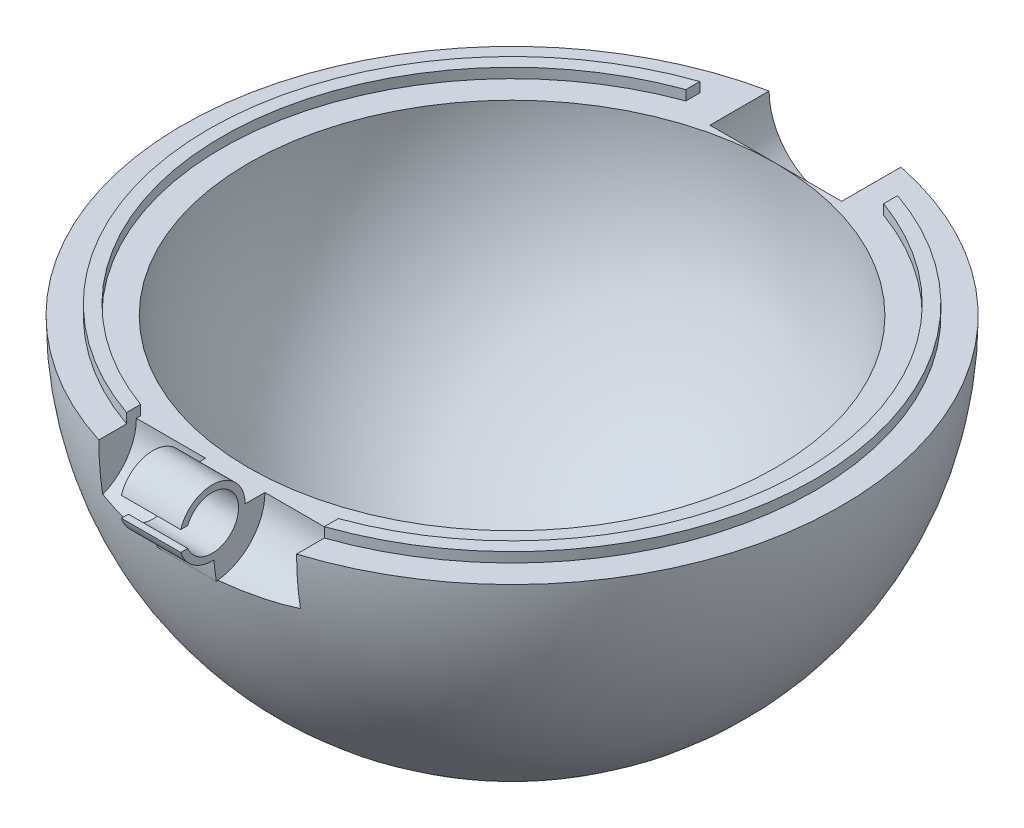
ISO-10303-21;
HEADER;
FILE_DESCRIPTION(('STEP AP214'),'2;1');
FILE_NAME('part.step','',(''),(''),'','','');
FILE_SCHEMA(('AUTOMOTIVE_DESIGN { 1 0 10303 214 1 1 1 1 }'));
ENDSEC;
DATA;
#1=APPLICATION_CONTEXT('core data for automotive mechanical design processes');
#2=APPLICATION_PROTOCOL_DEFINITION('international standard','automotive_design',2000,#1);
#3=PRODUCT_CONTEXT('',#1,'mechanical');
#4=PRODUCT('Part','Part','',(#3));
#5=PRODUCT_RELATED_PRODUCT_CATEGORY('part','',(#4));
#6=PRODUCT_DEFINITION_FORMATION('','',#4);
#7=PRODUCT_DEFINITION_CONTEXT('part definition',#1,'design');
#8=PRODUCT_DEFINITION('design','',#6,#7);
#9=PRODUCT_DEFINITION_SHAPE('','',#8);
#10=(LENGTH_UNIT() NAMED_UNIT(*) SI_UNIT(.MILLI.,.METRE.));
#11=(NAMED_UNIT(*) PLANE_ANGLE_UNIT() SI_UNIT($,.RADIAN.));
#12=(NAMED_UNIT(*) SI_UNIT($,.STERADIAN.) SOLID_ANGLE_UNIT());
#13=UNCERTAINTY_MEASURE_WITH_UNIT(LENGTH_MEASURE(1.E-05),#10,'distance_accuracy_value','');
#14=(GEOMETRIC_REPRESENTATION_CONTEXT(3) GLOBAL_UNCERTAINTY_ASSIGNED_CONTEXT((#13)) GLOBAL_UNIT_ASSIGNED_CONTEXT((#10,
#11,#12)) REPRESENTATION_CONTEXT('',''));
#15=CARTESIAN_POINT('',(0.,0.,0.));
#16=DIRECTION('',(0.,0.,1.));
#17=DIRECTION('',(1.,0.,0.));
#18=AXIS2_PLACEMENT_3D('',#15,#16,#17);
#19=CARTESIAN_POINT('',(-4.5,0.,50.));
#20=DIRECTION('',(1.,0.,0.));
#21=DIRECTION('',(0.,0.,-1.));
#22=AXIS2_PLACEMENT_3D('',#19,#20,#21);
#23=PLANE('',#22);
#24=DIRECTION('',(0.,0.,-1.));
#25=VECTOR('',#24,1.);
#26=CARTESIAN_POINT('',(-4.5,-1.5,60.));
#27=LINE('',#26,#25);
#28=CARTESIAN_POINT('',(-4.5,-1.5,54.7696960070847));
#29=VERTEX_POINT('',#28);
#30=CARTESIAN_POINT('',(-4.5,-1.5,53.7080992435478));
#31=VERTEX_POINT('',#30);
#32=EDGE_CURVE('E61',#29,#31,#27,.T.);
#33=ORIENTED_EDGE('',*,*,#32,.T.);
#34=CARTESIAN_POINT('',(-4.5,0.,50.));
#35=DIRECTION('',(-1.,0.,0.));
#36=DIRECTION('',(0.,0.,-1.));
#37=AXIS2_PLACEMENT_3D('',#34,#35,#36);
#38=CIRCLE('',#37,4.00000000000001);
#39=CARTESIAN_POINT('',(-4.5,1.5,53.7080992435478));
#40=VERTEX_POINT('',#39);
#41=EDGE_CURVE('E217',#40,#31,#38,.T.);
#42=ORIENTED_EDGE('',*,*,#41,.F.);
#43=DIRECTION('',(0.,0.,1.));
#44=VECTOR('',#43,1.);
#45=CARTESIAN_POINT('',(-4.5,1.5,60.));
#46=LINE('',#45,#44);
#47=CARTESIAN_POINT('',(-4.5,1.5,54.7696960070847));
#48=VERTEX_POINT('',#47);
#49=EDGE_CURVE('E202',#40,#48,#46,.T.);
#50=ORIENTED_EDGE('',*,*,#49,.T.);
#51=CARTESIAN_POINT('',(-4.5,0.,50.));
#52=DIRECTION('',(1.,0.,0.));
#53=DIRECTION('',(0.,0.,-1.));
#54=AXIS2_PLACEMENT_3D('',#51,#52,#53);
#55=CIRCLE('',#54,5.);
#56=CARTESIAN_POINT('',(-4.5,0.,45.));
#57=VERTEX_POINT('',#56);
#58=EDGE_CURVE('E400',#57,#48,#55,.T.);
#59=ORIENTED_EDGE('',*,*,#58,.F.);
#60=DIRECTION('',(0.,0.,1.));
#61=VECTOR('',#60,1.);
#62=CARTESIAN_POINT('',(-4.5,0.,46.));
#63=LINE('',#62,#61);
#64=CARTESIAN_POINT('',(-4.5,0.,42.));
#65=VERTEX_POINT('',#64);
#66=EDGE_CURVE('E224',#65,#57,#63,.T.);
#67=ORIENTED_EDGE('',*,*,#66,.F.);
#68=CARTESIAN_POINT('',(-4.5,0.,50.));
#69=DIRECTION('',(1.,0.,0.));
#70=DIRECTION('',(0.,0.,-1.));
#71=AXIS2_PLACEMENT_3D('',#68,#69,#70);
#72=CIRCLE('',#71,8.);
#73=CARTESIAN_POINT('',(-4.5,-7.95551341837847,49.1575));
#74=VERTEX_POINT('',#73);
#75=EDGE_CURVE('E523',#74,#65,#72,.T.);
#76=ORIENTED_EDGE('',*,*,#75,.F.);
#77=CARTESIAN_POINT('',(-4.5,0.,0.));
#78=DIRECTION('',(1.,0.,0.));
#79=DIRECTION('',(0.,0.,-1.));
#80=AXIS2_PLACEMENT_3D('',#77,#78,#79);
#81=CIRCLE('',#80,49.7970882682914);
#82=CARTESIAN_POINT('',(-4.5,-8.,49.1502797550533));
#83=VERTEX_POINT('',#82);
#84=EDGE_CURVE('E317',#74,#83,#81,.T.);
#85=ORIENTED_EDGE('',*,*,#84,.T.);
#86=DIRECTION('',(0.,0.,-1.));
#87=VECTOR('',#86,1.);
#88=CARTESIAN_POINT('',(-4.5,-8.,49.3558507170123));
#89=LINE('',#88,#87);
#90=CARTESIAN_POINT('',(-4.5,-8.,49.3558507170123));
#91=VERTEX_POINT('',#90);
#92=EDGE_CURVE('E424',#91,#83,#89,.T.);
#93=ORIENTED_EDGE('',*,*,#92,.F.);
#94=CARTESIAN_POINT('',(-4.5,0.,0.));
#95=DIRECTION('',(1.,0.,0.));
#96=DIRECTION('',(0.,0.,-1.));
#97=AXIS2_PLACEMENT_3D('',#94,#95,#96);
#98=CIRCLE('',#97,50.);
#99=CARTESIAN_POINT('',(-4.5,-4.99999999999999,49.749371855331));
#100=VERTEX_POINT('',#99);
#101=EDGE_CURVE('E426',#100,#91,#98,.T.);
#102=ORIENTED_EDGE('',*,*,#101,.F.);
#103=DIRECTION('',(0.,0.,-1.));
#104=VECTOR('',#103,1.);
#105=CARTESIAN_POINT('',(-4.5,-5.,50.));
#106=LINE('',#105,#104);
#107=CARTESIAN_POINT('',(-4.5,-5.,50.));
#108=VERTEX_POINT('',#107);
#109=EDGE_CURVE('E223',#108,#100,#106,.T.);
#110=ORIENTED_EDGE('',*,*,#109,.F.);
#111=EDGE_CURVE('E399',#29,#108,#55,.T.);
#112=ORIENTED_EDGE('',*,*,#111,.F.);
#113=EDGE_LOOP('',(#33,#42,#50,#59,#67,#76,#85,#93,#102,#110,#112));
#114=FACE_BOUND('',#113,.T.);
#115=ADVANCED_FACE('F37',(#114),#23,.F.);
#116=CARTESIAN_POINT('',(4.5,0.,50.));
#117=DIRECTION('',(1.,0.,0.));
#118=DIRECTION('',(0.,0.,-1.));
#119=AXIS2_PLACEMENT_3D('',#116,#117,#118);
#120=PLANE('',#119);
#121=CARTESIAN_POINT('',(4.5,0.,50.));
#122=DIRECTION('',(-1.,0.,0.));
#123=DIRECTION('',(0.,0.,-1.));
#124=AXIS2_PLACEMENT_3D('',#121,#122,#123);
#125=CIRCLE('',#124,4.00000000000001);
#126=CARTESIAN_POINT('',(4.5,1.5,53.7080992435478));
#127=VERTEX_POINT('',#126);
#128=CARTESIAN_POINT('',(4.5,-1.5,53.7080992435478));
#129=VERTEX_POINT('',#128);
#130=EDGE_CURVE('E219',#127,#129,#125,.T.);
#131=ORIENTED_EDGE('',*,*,#130,.T.);
#132=DIRECTION('',(0.,0.,-1.));
#133=VECTOR('',#132,1.);
#134=CARTESIAN_POINT('',(4.5,-1.5,60.));
#135=LINE('',#134,#133);
#136=CARTESIAN_POINT('',(4.5,-1.5,54.7696960070847));
#137=VERTEX_POINT('',#136);
#138=EDGE_CURVE('E210',#137,#129,#135,.T.);
#139=ORIENTED_EDGE('',*,*,#138,.F.);
#140=CARTESIAN_POINT('',(4.5,0.,50.));
#141=DIRECTION('',(1.,0.,0.));
#142=DIRECTION('',(0.,0.,-1.));
#143=AXIS2_PLACEMENT_3D('',#140,#141,#142);
#144=CIRCLE('',#143,5.);
#145=CARTESIAN_POINT('',(4.5,-5.,50.));
#146=VERTEX_POINT('',#145);
#147=EDGE_CURVE('E395',#137,#146,#144,.T.);
#148=ORIENTED_EDGE('',*,*,#147,.T.);
#149=DIRECTION('',(0.,0.,-1.));
#150=VECTOR('',#149,1.);
#151=CARTESIAN_POINT('',(4.5,-5.,50.));
#152=LINE('',#151,#150);
#153=CARTESIAN_POINT('',(4.5,-4.99999999999999,49.749371855331));
#154=VERTEX_POINT('',#153);
#155=EDGE_CURVE('E230',#146,#154,#152,.T.);
#156=ORIENTED_EDGE('',*,*,#155,.T.);
#157=CARTESIAN_POINT('',(4.5,0.,0.));
#158=DIRECTION('',(1.,0.,0.));
#159=DIRECTION('',(0.,0.,-1.));
#160=AXIS2_PLACEMENT_3D('',#157,#158,#159);
#161=CIRCLE('',#160,50.);
#162=CARTESIAN_POINT('',(4.5,-8.,49.3558507170123));
#163=VERTEX_POINT('',#162);
#164=EDGE_CURVE('E412',#154,#163,#161,.T.);
#165=ORIENTED_EDGE('',*,*,#164,.T.);
#166=DIRECTION('',(0.,0.,-1.));
#167=VECTOR('',#166,1.);
#168=CARTESIAN_POINT('',(4.5,-8.,49.3558507170123));
#169=LINE('',#168,#167);
#170=CARTESIAN_POINT('',(4.5,-8.,49.1502797550533));
#171=VERTEX_POINT('',#170);
#172=EDGE_CURVE('E431',#163,#171,#169,.T.);
#173=ORIENTED_EDGE('',*,*,#172,.T.);
#174=CARTESIAN_POINT('',(4.5,0.,0.));
#175=DIRECTION('',(1.,0.,0.));
#176=DIRECTION('',(0.,0.,-1.));
#177=AXIS2_PLACEMENT_3D('',#174,#175,#176);
#178=CIRCLE('',#177,49.7970882682914);
#179=CARTESIAN_POINT('',(4.5,-7.95551341837847,49.1575));
#180=VERTEX_POINT('',#179);
#181=EDGE_CURVE('E322',#180,#171,#178,.T.);
#182=ORIENTED_EDGE('',*,*,#181,.F.);
#183=CARTESIAN_POINT('',(4.5,0.,50.));
#184=DIRECTION('',(1.,0.,0.));
#185=DIRECTION('',(0.,0.,-1.));
#186=AXIS2_PLACEMENT_3D('',#183,#184,#185);
#187=CIRCLE('',#186,8.);
#188=CARTESIAN_POINT('',(4.5,0.,42.));
#189=VERTEX_POINT('',#188);
#190=EDGE_CURVE('E519',#180,#189,#187,.T.);
#191=ORIENTED_EDGE('',*,*,#190,.T.);
#192=DIRECTION('',(0.,0.,1.));
#193=VECTOR('',#192,1.);
#194=CARTESIAN_POINT('',(4.5,0.,46.));
#195=LINE('',#194,#193);
#196=CARTESIAN_POINT('',(4.5,0.,45.));
#197=VERTEX_POINT('',#196);
#198=EDGE_CURVE('E405',#189,#197,#195,.T.);
#199=ORIENTED_EDGE('',*,*,#198,.T.);
#200=CARTESIAN_POINT('',(4.5,1.5,54.7696960070847));
#201=VERTEX_POINT('',#200);
#202=EDGE_CURVE('E396',#197,#201,#144,.T.);
#203=ORIENTED_EDGE('',*,*,#202,.T.);
#204=DIRECTION('',(0.,0.,1.));
#205=VECTOR('',#204,1.);
#206=CARTESIAN_POINT('',(4.5,1.5,60.));
#207=LINE('',#206,#205);
#208=EDGE_CURVE('E53',#127,#201,#207,.T.);
#209=ORIENTED_EDGE('',*,*,#208,.F.);
#210=EDGE_LOOP('',(#131,#139,#148,#156,#165,#173,#182,#191,#199,#203,#209));
#211=FACE_BOUND('',#210,.T.);
#212=ADVANCED_FACE('F278',(#211),#120,.T.);
#213=CARTESIAN_POINT('',(-4.5,0.,50.));
#214=DIRECTION('',(1.,0.,0.));
#215=DIRECTION('',(0.,0.,-1.));
#216=AXIS2_PLACEMENT_3D('',#213,#214,#215);
#217=CYLINDRICAL_SURFACE('',#216,4.00000000000001);
#218=ORIENTED_EDGE('',*,*,#41,.T.);
#219=DIRECTION('',(1.,0.,0.));
#220=VECTOR('',#219,1.);
#221=CARTESIAN_POINT('',(-4.5,-1.5,53.7080992435478));
#222=LINE('',#221,#220);
#223=EDGE_CURVE('E220',#31,#129,#222,.T.);
#224=ORIENTED_EDGE('',*,*,#223,.T.);
#225=ORIENTED_EDGE('',*,*,#130,.F.);
#226=DIRECTION('',(1.,0.,0.));
#227=VECTOR('',#226,1.);
#228=CARTESIAN_POINT('',(-4.5,1.5,53.7080992435478));
#229=LINE('',#228,#227);
#230=EDGE_CURVE('E205',#127,#40,#229,.F.);
#231=ORIENTED_EDGE('',*,*,#230,.T.);
#232=EDGE_LOOP('',(#218,#224,#225,#231));
#233=FACE_BOUND('',#232,.T.);
#234=ADVANCED_FACE('F215',(#233),#217,.F.);
#235=CARTESIAN_POINT('',(-4.5,0.,50.));
#236=DIRECTION('',(1.,0.,0.));
#237=DIRECTION('',(0.,0.,-1.));
#238=AXIS2_PLACEMENT_3D('',#235,#236,#237);
#239=CYLINDRICAL_SURFACE('',#238,5.);
#240=ORIENTED_EDGE('',*,*,#147,.F.);
#241=DIRECTION('',(1.,0.,0.));
#242=VECTOR('',#241,1.);
#243=CARTESIAN_POINT('',(-4.5,-1.5,54.7696960070847));
#244=LINE('',#243,#242);
#245=EDGE_CURVE('E11',#137,#29,#244,.F.);
#246=ORIENTED_EDGE('',*,*,#245,.T.);
#247=ORIENTED_EDGE('',*,*,#111,.T.);
#248=DIRECTION('',(1.,0.,0.));
#249=VECTOR('',#248,1.);
#250=CARTESIAN_POINT('',(-4.5,-5.,50.));
#251=LINE('',#250,#249);
#252=EDGE_CURVE('E227',#108,#146,#251,.T.);
#253=ORIENTED_EDGE('',*,*,#252,.T.);
#254=EDGE_LOOP('',(#240,#246,#247,#253));
#255=FACE_BOUND('',#254,.T.);
#256=ADVANCED_FACE('F296',(#255),#239,.T.);
#257=ORIENTED_EDGE('',*,*,#58,.T.);
#258=DIRECTION('',(1.,0.,0.));
#259=VECTOR('',#258,1.);
#260=CARTESIAN_POINT('',(-4.5,1.5,54.7696960070847));
#261=LINE('',#260,#259);
#262=EDGE_CURVE('E46',#48,#201,#261,.T.);
#263=ORIENTED_EDGE('',*,*,#262,.T.);
#264=ORIENTED_EDGE('',*,*,#202,.F.);
#265=DIRECTION('',(1.,0.,0.));
#266=VECTOR('',#265,1.);
#267=CARTESIAN_POINT('',(-4.5,0.,45.));
#268=LINE('',#267,#266);
#269=EDGE_CURVE('E402',#57,#197,#268,.T.);
#270=ORIENTED_EDGE('',*,*,#269,.F.);
#271=EDGE_LOOP('',(#257,#263,#264,#270));
#272=FACE_BOUND('',#271,.T.);
#273=ADVANCED_FACE('F498',(#272),#239,.T.);
#274=CARTESIAN_POINT('',(0.,0.,0.));
#275=DIRECTION('',(0.,1.,0.));
#276=DIRECTION('',(0.,0.,1.));
#277=AXIS2_PLACEMENT_3D('',#274,#275,#276);
#278=SPHERICAL_SURFACE('',#277,50.);
#279=CARTESIAN_POINT('',(0.,-49.,0.));
#280=DIRECTION('',(0.,1.,0.));
#281=DIRECTION('',(0.,0.,1.));
#282=AXIS2_PLACEMENT_3D('',#279,#280,#281);
#283=CIRCLE('',#282,9.94987437106621);
#284=CARTESIAN_POINT('',(0.,-49.,9.94987437106621));
#285=VERTEX_POINT('',#284);
#286=EDGE_CURVE('E41',#285,#285,#283,.T.);
#287=ORIENTED_EDGE('',*,*,#286,.T.);
#288=EDGE_LOOP('',(#287));
#289=FACE_BOUND('',#288,.T.);
#290=CARTESIAN_POINT('',(0.,-8.,0.));
#291=DIRECTION('',(0.,-1.,0.));
#292=DIRECTION('',(0.,0.,-1.));
#293=AXIS2_PLACEMENT_3D('',#290,#291,#292);
#294=CIRCLE('',#293,49.3558507170123);
#295=CARTESIAN_POINT('',(0.,-8.,49.3558507170123));
#296=VERTEX_POINT('',#295);
#297=EDGE_CURVE('E506',#171,#296,#294,.T.);
#298=ORIENTED_EDGE('',*,*,#297,.T.);
#299=EDGE_CURVE('E318',#296,#83,#294,.T.);
#300=ORIENTED_EDGE('',*,*,#299,.T.);
#301=ORIENTED_EDGE('',*,*,#84,.F.);
#302=CARTESIAN_POINT('',(-15.0002,-7.45972876142879,47.1099399996));
#303=CARTESIAN_POINT('',(-14.6888530687593,-7.4959031705375,47.2033478901416));
#304=CARTESIAN_POINT('',(-14.3763965852291,-7.52908795381116,47.2941754954832));
#305=CARTESIAN_POINT('',(-13.7494872101298,-7.5901499362965,47.4704978083294));
#306=CARTESIAN_POINT('',(-13.4350344492616,-7.6180274793561,47.5559928610805));
#307=CARTESIAN_POINT('',(-12.8043919957342,-7.66914490667064,47.7214696381008));
#308=CARTESIAN_POINT('',(-12.4882027470554,-7.69238592439563,47.8014527067222));
#309=CARTESIAN_POINT('',(-11.8541828357584,-7.73483024667799,47.9557886139855));
#310=CARTESIAN_POINT('',(-11.5363521381358,-7.75403346476092,48.0301413320247));
#311=CARTESIAN_POINT('',(-10.5809083714154,-7.80640245269474,48.2444985226752));
#312=CARTESIAN_POINT('',(-9.94104836554301,-7.83435040948474,48.3758796730003));
#313=CARTESIAN_POINT('',(-8.6565198175824,-7.88009601245021,48.6147726154212));
#314=CARTESIAN_POINT('',(-8.01185096977376,-7.89789300761327,48.7222828763335));
#315=CARTESIAN_POINT('',(-6.73380605240564,-7.92602898385907,48.910546255728));
#316=CARTESIAN_POINT('',(-6.10051680071301,-7.93653205906435,48.9918643975638));
#317=CARTESIAN_POINT('',(-4.83126955757509,-7.95292732555413,49.1306158378707));
#318=CARTESIAN_POINT('',(-4.19531156823255,-7.95881952047098,49.1880491551577));
#319=CARTESIAN_POINT('',(-2.92164308844565,-7.96754630594163,49.2786956269164));
#320=CARTESIAN_POINT('',(-2.2839325779643,-7.9703808613897,49.3119085033041));
#321=CARTESIAN_POINT('',(-1.00769917193379,-7.9738964571722,49.3539172990342));
#322=CARTESIAN_POINT('',(-0.369176275129756,-7.97457749417615,49.3627131806151));
#323=CARTESIAN_POINT('',(0.885830076824557,-7.97403336230993,49.3559545571271));
#324=CARTESIAN_POINT('',(1.50231816327005,-7.97287278410223,49.3412250374269));
#325=CARTESIAN_POINT('',(2.73431673486778,-7.96838806957356,49.2890295864119));
#326=CARTESIAN_POINT('',(3.34982723120204,-7.96506395818115,49.2515639170669));
#327=CARTESIAN_POINT('',(4.57899989099898,-7.95530372211397,49.1541045852683));
#328=CARTESIAN_POINT('',(5.19266216142783,-7.94886778115964,49.0941122528216));
#329=CARTESIAN_POINT('',(6.41734468891532,-7.93137262189015,48.9519264521163));
#330=CARTESIAN_POINT('',(7.02836494672743,-7.92031340489356,48.8697329901897));
#331=CARTESIAN_POINT('',(8.26096414276292,-7.8911792636722,48.6814500773761));
#332=CARTESIAN_POINT('',(8.88246199239887,-7.87294856617016,48.5748536881985));
#333=CARTESIAN_POINT('',(10.1208752966843,-7.82669671479143,48.3395121712322));
#334=CARTESIAN_POINT('',(10.7377910317662,-7.7986761651956,48.210768410744));
#335=CARTESIAN_POINT('',(11.6590801255058,-7.74671170221409,48.0016027654434));
#336=CARTESIAN_POINT('',(11.9655743223126,-7.72772842486744,47.92918511715));
#337=CARTESIAN_POINT('',(12.577018184939,-7.68594604276616,47.7791206479801));
#338=CARTESIAN_POINT('',(12.8819678810575,-7.66314701316688,47.7014739301138));
#339=CARTESIAN_POINT('',(13.4902371040152,-7.61319147042788,47.5410600910073));
#340=CARTESIAN_POINT('',(13.793556237103,-7.586033949693,47.4582917884852));
#341=CARTESIAN_POINT('',(14.398328225634,-7.52675571146532,47.2877964638393));
#342=CARTESIAN_POINT('',(14.6997809689922,-7.49463469884293,47.200069147049));
#343=CARTESIAN_POINT('',(15.0002,-7.45972876142879,47.1099399996));
#344=B_SPLINE_CURVE_WITH_KNOTS('',3,(#302,#303,#304,#305,#306,#307,#308,#309,#310,#311,#312,
#313,#314,#315,#316,#317,#318,#319,#320,#321,#322,#323,#324,#325,#326,#327,#328,#329,#330,#331,
#332,#333,#334,#335,#336,#337,#338,#339,#340,#341,#342,#343),.UNSPECIFIED.,.F.,.F.,(4,2,2,2,2,2,
2,2,2,2,2,2,2,2,2,2,2,2,2,2,4),(0.,0.981148067695497,1.96223254667004,2.94307688973074,
3.9239422366358,5.88475521814539,7.8456939384901,9.76094745915174,11.6761994710182,
13.5914734722681,15.5067504355373,17.3563240936873,19.2058764411459,21.0553196055315,
22.9047622424467,24.7968166276118,26.688754245912,27.6352117750849,28.581650664947,
29.5283086683821,30.4750229818455),.UNSPECIFIED.);
#345=CARTESIAN_POINT('',(-15.,-7.45975200660183,47.11));
#346=VERTEX_POINT('',#345);
#347=EDGE_CURVE('E247',#346,#74,#344,.T.);
#348=ORIENTED_EDGE('',*,*,#347,.F.);
#349=CARTESIAN_POINT('',(-15.,0.,0.));
#350=DIRECTION('',(1.,0.,0.));
#351=DIRECTION('',(0.,0.,-1.));
#352=AXIS2_PLACEMENT_3D('',#349,#350,#351);
#353=CIRCLE('',#352,47.6969600708473);
#354=CARTESIAN_POINT('',(-15.,0.,47.6969600708473));
#355=VERTEX_POINT('',#354);
#356=EDGE_CURVE('E241',#355,#346,#353,.T.);
#357=ORIENTED_EDGE('',*,*,#356,.F.);
#358=CARTESIAN_POINT('',(0.,0.,0.));
#359=DIRECTION('',(0.,1.,0.));
#360=DIRECTION('',(0.,0.,1.));
#361=AXIS2_PLACEMENT_3D('',#358,#359,#360);
#362=CIRCLE('',#361,50.);
#363=CARTESIAN_POINT('',(-9.99999999999998,0.,-48.9897948556636));
#364=VERTEX_POINT('',#363);
#365=EDGE_CURVE('E539',#364,#355,#362,.T.);
#366=ORIENTED_EDGE('',*,*,#365,.F.);
#367=CARTESIAN_POINT('',(0.,0.,-48.9897948556636));
#368=DIRECTION('',(0.,0.,1.));
#369=DIRECTION('',(1.,0.,0.));
#370=AXIS2_PLACEMENT_3D('',#367,#368,#369);
#371=CIRCLE('',#370,10.);
#372=CARTESIAN_POINT('',(10.,0.,-48.9897948556636));
#373=VERTEX_POINT('',#372);
#374=EDGE_CURVE('E393',#373,#364,#371,.F.);
#375=ORIENTED_EDGE('',*,*,#374,.F.);
#376=CARTESIAN_POINT('',(15.,0.,47.6969600708473));
#377=VERTEX_POINT('',#376);
#378=EDGE_CURVE('E540',#377,#373,#362,.T.);
#379=ORIENTED_EDGE('',*,*,#378,.F.);
#380=CARTESIAN_POINT('',(15.,0.,0.));
#381=DIRECTION('',(1.,0.,0.));
#382=DIRECTION('',(0.,0.,-1.));
#383=AXIS2_PLACEMENT_3D('',#380,#381,#382);
#384=CIRCLE('',#383,47.6969600708473);
#385=CARTESIAN_POINT('',(15.,-7.45975200660183,47.11));
#386=VERTEX_POINT('',#385);
#387=EDGE_CURVE('E243',#377,#386,#384,.T.);
#388=ORIENTED_EDGE('',*,*,#387,.T.);
#389=EDGE_CURVE('E246',#180,#386,#344,.T.);
#390=ORIENTED_EDGE('',*,*,#389,.F.);
#391=ORIENTED_EDGE('',*,*,#181,.T.);
#392=EDGE_LOOP('',(#298,#300,#301,#348,#357,#366,#375,#379,#388,#390,#391));
#393=FACE_BOUND('',#392,.T.);
#394=ADVANCED_FACE('F256',(#289,#393),#278,.T.);
#395=CARTESIAN_POINT('',(15.,0.,50.));
#396=DIRECTION('',(-1.,0.,0.));
#397=DIRECTION('',(0.,0.,1.));
#398=AXIS2_PLACEMENT_3D('',#395,#396,#397);
#399=CYLINDRICAL_SURFACE('',#398,8.);
#400=ORIENTED_EDGE('',*,*,#347,.T.);
#401=ORIENTED_EDGE('',*,*,#75,.T.);
#402=DIRECTION('',(-1.,0.,0.));
#403=VECTOR('',#402,1.);
#404=CARTESIAN_POINT('',(15.,0.,42.));
#405=LINE('',#404,#403);
#406=CARTESIAN_POINT('',(-15.,0.,42.));
#407=VERTEX_POINT('',#406);
#408=EDGE_CURVE('E313',#65,#407,#405,.T.);
#409=ORIENTED_EDGE('',*,*,#408,.T.);
#410=CARTESIAN_POINT('',(-15.,0.,50.));
#411=DIRECTION('',(1.,0.,0.));
#412=DIRECTION('',(0.,0.,-1.));
#413=AXIS2_PLACEMENT_3D('',#410,#411,#412);
#414=CIRCLE('',#413,8.);
#415=EDGE_CURVE('E236',#346,#407,#414,.T.);
#416=ORIENTED_EDGE('',*,*,#415,.F.);
#417=EDGE_LOOP('',(#400,#401,#409,#416));
#418=FACE_BOUND('',#417,.T.);
#419=ADVANCED_FACE('F265',(#418),#399,.F.);
#420=CARTESIAN_POINT('',(0.,0.,-40.));
#421=DIRECTION('',(0.,-1.,0.));
#422=DIRECTION('',(0.,0.,-1.));
#423=AXIS2_PLACEMENT_3D('',#420,#421,#422);
#424=PLANE('',#423);
#425=CARTESIAN_POINT('',(0.,0.,0.));
#426=DIRECTION('',(0.,1.,0.));
#427=DIRECTION('',(0.,0.,1.));
#428=AXIS2_PLACEMENT_3D('',#425,#426,#427);
#429=CIRCLE('',#428,46.);
#430=CARTESIAN_POINT('',(15.,0.,43.4856298103178));
#431=VERTEX_POINT('',#430);
#432=CARTESIAN_POINT('',(15.,0.,-43.4856298103178));
#433=VERTEX_POINT('',#432);
#434=EDGE_CURVE('E321',#431,#433,#429,.T.);
#435=ORIENTED_EDGE('',*,*,#434,.F.);
#436=DIRECTION('',(0.,0.,1.));
#437=VECTOR('',#436,1.);
#438=CARTESIAN_POINT('',(15.,0.,-40.));
#439=LINE('',#438,#437);
#440=EDGE_CURVE('E529',#431,#377,#439,.T.);
#441=ORIENTED_EDGE('',*,*,#440,.T.);
#442=ORIENTED_EDGE('',*,*,#378,.T.);
#443=DIRECTION('',(0.,0.,-1.));
#444=VECTOR('',#443,1.);
#445=CARTESIAN_POINT('',(10.,0.,-40.));
#446=LINE('',#445,#444);
#447=CARTESIAN_POINT('',(10.,0.,-40.));
#448=VERTEX_POINT('',#447);
#449=EDGE_CURVE('E513',#448,#373,#446,.T.);
#450=ORIENTED_EDGE('',*,*,#449,.F.);
#451=DIRECTION('',(-1.,0.,0.));
#452=VECTOR('',#451,1.);
#453=CARTESIAN_POINT('',(0.,0.,-40.));
#454=LINE('',#453,#452);
#455=CARTESIAN_POINT('',(0.,0.,-40.));
#456=VERTEX_POINT('',#455);
#457=EDGE_CURVE('E527',#448,#456,#454,.T.);
#458=ORIENTED_EDGE('',*,*,#457,.T.);
#459=CARTESIAN_POINT('',(0.,0.,0.));
#460=DIRECTION('',(0.,1.,0.));
#461=DIRECTION('',(0.,0.,1.));
#462=AXIS2_PLACEMENT_3D('',#459,#460,#461);
#463=CIRCLE('',#462,40.);
#464=EDGE_CURVE('E254',#456,#456,#463,.T.);
#465=ORIENTED_EDGE('',*,*,#464,.F.);
#466=CARTESIAN_POINT('',(-10.,0.,-40.));
#467=VERTEX_POINT('',#466);
#468=EDGE_CURVE('E524',#456,#467,#454,.T.);
#469=ORIENTED_EDGE('',*,*,#468,.T.);
#470=DIRECTION('',(0.,0.,-1.));
#471=VECTOR('',#470,1.);
#472=CARTESIAN_POINT('',(-10.,0.,-40.));
#473=LINE('',#472,#471);
#474=EDGE_CURVE('E510',#364,#467,#473,.F.);
#475=ORIENTED_EDGE('',*,*,#474,.F.);
#476=ORIENTED_EDGE('',*,*,#365,.T.);
#477=DIRECTION('',(0.,0.,1.));
#478=VECTOR('',#477,1.);
#479=CARTESIAN_POINT('',(-15.,0.,-40.));
#480=LINE('',#479,#478);
#481=CARTESIAN_POINT('',(-15.,0.,43.4856298103178));
#482=VERTEX_POINT('',#481);
#483=EDGE_CURVE('E306',#482,#355,#480,.T.);
#484=ORIENTED_EDGE('',*,*,#483,.F.);
#485=CARTESIAN_POINT('',(0.,0.,0.));
#486=DIRECTION('',(0.,1.,0.));
#487=DIRECTION('',(0.,0.,1.));
#488=AXIS2_PLACEMENT_3D('',#485,#486,#487);
#489=CIRCLE('',#488,46.);
#490=CARTESIAN_POINT('',(-15.,0.,-43.4856298103178));
#491=VERTEX_POINT('',#490);
#492=EDGE_CURVE('E377',#491,#482,#489,.T.);
#493=ORIENTED_EDGE('',*,*,#492,.F.);
#494=DIRECTION('',(0.,0.,-1.));
#495=VECTOR('',#494,1.);
#496=CARTESIAN_POINT('',(-15.,0.,-43.4856298103178));
#497=LINE('',#496,#495);
#498=CARTESIAN_POINT('',(-15.,0.,-41.3642357598929));
#499=VERTEX_POINT('',#498);
#500=EDGE_CURVE('E375',#499,#491,#497,.T.);
#501=ORIENTED_EDGE('',*,*,#500,.F.);
#502=CARTESIAN_POINT('',(0.,0.,0.));
#503=DIRECTION('',(0.,-1.,0.));
#504=DIRECTION('',(0.,0.,1.));
#505=AXIS2_PLACEMENT_3D('',#502,#503,#504);
#506=CIRCLE('',#505,44.);
#507=CARTESIAN_POINT('',(-15.,0.,41.3642357598929));
#508=VERTEX_POINT('',#507);
#509=EDGE_CURVE('E361',#508,#499,#506,.T.);
#510=ORIENTED_EDGE('',*,*,#509,.F.);
#511=DIRECTION('',(0.,0.,-1.));
#512=VECTOR('',#511,1.);
#513=CARTESIAN_POINT('',(-15.,0.,41.3642357598929));
#514=LINE('',#513,#512);
#515=EDGE_CURVE('E366',#407,#508,#514,.T.);
#516=ORIENTED_EDGE('',*,*,#515,.F.);
#517=ORIENTED_EDGE('',*,*,#408,.F.);
#518=ORIENTED_EDGE('',*,*,#66,.T.);
#519=ORIENTED_EDGE('',*,*,#269,.T.);
#520=ORIENTED_EDGE('',*,*,#198,.F.);
#521=CARTESIAN_POINT('',(15.,0.,42.));
#522=VERTEX_POINT('',#521);
#523=EDGE_CURVE('E521',#522,#189,#405,.T.);
#524=ORIENTED_EDGE('',*,*,#523,.F.);
#525=DIRECTION('',(0.,0.,1.));
#526=VECTOR('',#525,1.);
#527=CARTESIAN_POINT('',(15.,0.,41.3642357598929));
#528=LINE('',#527,#526);
#529=CARTESIAN_POINT('',(15.,0.,41.3642357598929));
#530=VERTEX_POINT('',#529);
#531=EDGE_CURVE('E336',#530,#522,#528,.T.);
#532=ORIENTED_EDGE('',*,*,#531,.F.);
#533=CARTESIAN_POINT('',(0.,0.,0.));
#534=DIRECTION('',(0.,-1.,0.));
#535=DIRECTION('',(0.,0.,1.));
#536=AXIS2_PLACEMENT_3D('',#533,#534,#535);
#537=CIRCLE('',#536,44.);
#538=CARTESIAN_POINT('',(15.,0.,-41.3642357598929));
#539=VERTEX_POINT('',#538);
#540=EDGE_CURVE('E345',#539,#530,#537,.T.);
#541=ORIENTED_EDGE('',*,*,#540,.F.);
#542=DIRECTION('',(0.,0.,1.));
#543=VECTOR('',#542,1.);
#544=CARTESIAN_POINT('',(15.,0.,-43.4856298103178));
#545=LINE('',#544,#543);
#546=EDGE_CURVE('E325',#433,#539,#545,.T.);
#547=ORIENTED_EDGE('',*,*,#546,.F.);
#548=EDGE_LOOP('',(#435,#441,#442,#450,#458,#465,#469,#475,#476,#484,#493,#501,#510,#516,#517,
#518,#519,#520,#524,#532,#541,#547));
#549=FACE_BOUND('',#548,.T.);
#550=ADVANCED_FACE('F263',(#549),#424,.F.);
#551=ORIENTED_EDGE('',*,*,#190,.F.);
#552=ORIENTED_EDGE('',*,*,#389,.T.);
#553=CARTESIAN_POINT('',(15.,0.,50.));
#554=DIRECTION('',(1.,0.,0.));
#555=DIRECTION('',(0.,0.,-1.));
#556=AXIS2_PLACEMENT_3D('',#553,#554,#555);
#557=CIRCLE('',#556,8.);
#558=EDGE_CURVE('E239',#386,#522,#557,.T.);
#559=ORIENTED_EDGE('',*,*,#558,.T.);
#560=ORIENTED_EDGE('',*,*,#523,.T.);
#561=EDGE_LOOP('',(#551,#552,#559,#560));
#562=FACE_BOUND('',#561,.T.);
#563=ADVANCED_FACE('F259',(#562),#399,.F.);
#564=CARTESIAN_POINT('',(0.,0.,0.));
#565=DIRECTION('',(0.,1.,0.));
#566=DIRECTION('',(0.,0.,-1.));
#567=AXIS2_PLACEMENT_3D('',#564,#565,#566);
#568=SPHERICAL_SURFACE('',#567,40.);
#569=ORIENTED_EDGE('',*,*,#464,.T.);
#570=EDGE_LOOP('',(#569));
#571=FACE_BOUND('',#570,.T.);
#572=ADVANCED_FACE('F39',(#571),#568,.F.);
#573=CARTESIAN_POINT('',(15.,0.,50.));
#574=DIRECTION('',(1.,0.,0.));
#575=DIRECTION('',(0.,0.,-1.));
#576=AXIS2_PLACEMENT_3D('',#573,#574,#575);
#577=PLANE('',#576);
#578=ORIENTED_EDGE('',*,*,#440,.F.);
#579=DIRECTION('',(0.,-1.,0.));
#580=VECTOR('',#579,1.);
#581=CARTESIAN_POINT('',(15.,1.5,43.4856298103178));
#582=LINE('',#581,#580);
#583=CARTESIAN_POINT('',(15.,1.5,43.4856298103178));
#584=VERTEX_POINT('',#583);
#585=EDGE_CURVE('E341',#584,#431,#582,.T.);
#586=ORIENTED_EDGE('',*,*,#585,.F.);
#587=DIRECTION('',(0.,0.,1.));
#588=VECTOR('',#587,1.);
#589=CARTESIAN_POINT('',(15.,1.5,41.3642357598929));
#590=LINE('',#589,#588);
#591=CARTESIAN_POINT('',(15.,1.5,41.3642357598929));
#592=VERTEX_POINT('',#591);
#593=EDGE_CURVE('E340',#592,#584,#590,.T.);
#594=ORIENTED_EDGE('',*,*,#593,.F.);
#595=DIRECTION('',(0.,-1.,0.));
#596=VECTOR('',#595,1.);
#597=CARTESIAN_POINT('',(15.,1.5,41.3642357598929));
#598=LINE('',#597,#596);
#599=EDGE_CURVE('E352',#592,#530,#598,.T.);
#600=ORIENTED_EDGE('',*,*,#599,.T.);
#601=ORIENTED_EDGE('',*,*,#531,.T.);
#602=ORIENTED_EDGE('',*,*,#558,.F.);
#603=ORIENTED_EDGE('',*,*,#387,.F.);
#604=EDGE_LOOP('',(#578,#586,#594,#600,#601,#602,#603));
#605=FACE_BOUND('',#604,.T.);
#606=ADVANCED_FACE('F266',(#605),#577,.F.);
#607=CARTESIAN_POINT('',(-15.,0.,50.));
#608=DIRECTION('',(1.,0.,0.));
#609=DIRECTION('',(0.,0.,-1.));
#610=AXIS2_PLACEMENT_3D('',#607,#608,#609);
#611=PLANE('',#610);
#612=ORIENTED_EDGE('',*,*,#356,.T.);
#613=ORIENTED_EDGE('',*,*,#415,.T.);
#614=ORIENTED_EDGE('',*,*,#515,.T.);
#615=DIRECTION('',(0.,-1.,0.));
#616=VECTOR('',#615,1.);
#617=CARTESIAN_POINT('',(-15.,1.5,41.3642357598929));
#618=LINE('',#617,#616);
#619=CARTESIAN_POINT('',(-15.,1.5,41.3642357598929));
#620=VERTEX_POINT('',#619);
#621=EDGE_CURVE('E372',#620,#508,#618,.T.);
#622=ORIENTED_EDGE('',*,*,#621,.F.);
#623=DIRECTION('',(0.,0.,-1.));
#624=VECTOR('',#623,1.);
#625=CARTESIAN_POINT('',(-15.,1.5,41.3642357598929));
#626=LINE('',#625,#624);
#627=CARTESIAN_POINT('',(-15.,1.5,43.4856298103178));
#628=VERTEX_POINT('',#627);
#629=EDGE_CURVE('E370',#628,#620,#626,.T.);
#630=ORIENTED_EDGE('',*,*,#629,.F.);
#631=DIRECTION('',(0.,-1.,0.));
#632=VECTOR('',#631,1.);
#633=CARTESIAN_POINT('',(-15.,1.5,43.4856298103178));
#634=LINE('',#633,#632);
#635=EDGE_CURVE('E383',#628,#482,#634,.T.);
#636=ORIENTED_EDGE('',*,*,#635,.T.);
#637=ORIENTED_EDGE('',*,*,#483,.T.);
#638=EDGE_LOOP('',(#612,#613,#614,#622,#630,#636,#637));
#639=FACE_BOUND('',#638,.T.);
#640=ADVANCED_FACE('F293',(#639),#611,.T.);
#641=CARTESIAN_POINT('',(-4.5,-5.,50.));
#642=DIRECTION('',(0.,-1.,0.));
#643=DIRECTION('',(0.,0.,-1.));
#644=AXIS2_PLACEMENT_3D('',#641,#642,#643);
#645=PLANE('',#644);
#646=DIRECTION('',(1.,0.,0.));
#647=VECTOR('',#646,1.);
#648=CARTESIAN_POINT('',(-4.5,-4.99999999999999,49.749371855331));
#649=LINE('',#648,#647);
#650=EDGE_CURVE('E419',#100,#154,#649,.T.);
#651=ORIENTED_EDGE('',*,*,#650,.T.);
#652=ORIENTED_EDGE('',*,*,#155,.F.);
#653=ORIENTED_EDGE('',*,*,#252,.F.);
#654=ORIENTED_EDGE('',*,*,#109,.T.);
#655=EDGE_LOOP('',(#651,#652,#653,#654));
#656=FACE_BOUND('',#655,.T.);
#657=ADVANCED_FACE('F289',(#656),#645,.T.);
#658=CARTESIAN_POINT('',(0.,0.,-40.));
#659=DIRECTION('',(0.,0.,-1.));
#660=DIRECTION('',(-1.,0.,0.));
#661=AXIS2_PLACEMENT_3D('',#658,#659,#660);
#662=CYLINDRICAL_SURFACE('',#661,10.);
#663=ORIENTED_EDGE('',*,*,#474,.T.);
#664=CARTESIAN_POINT('',(0.,0.,-40.));
#665=DIRECTION('',(0.,0.,1.));
#666=DIRECTION('',(1.,0.,0.));
#667=AXIS2_PLACEMENT_3D('',#664,#665,#666);
#668=CIRCLE('',#667,10.);
#669=EDGE_CURVE('E390',#467,#448,#668,.T.);
#670=ORIENTED_EDGE('',*,*,#669,.T.);
#671=ORIENTED_EDGE('',*,*,#449,.T.);
#672=ORIENTED_EDGE('',*,*,#374,.T.);
#673=EDGE_LOOP('',(#663,#670,#671,#672));
#674=FACE_BOUND('',#673,.T.);
#675=ADVANCED_FACE('F292',(#674),#662,.F.);
#676=CARTESIAN_POINT('',(0.,0.,-40.));
#677=DIRECTION('',(0.,0.,1.));
#678=DIRECTION('',(1.,0.,0.));
#679=AXIS2_PLACEMENT_3D('',#676,#677,#678);
#680=PLANE('',#679);
#681=ORIENTED_EDGE('',*,*,#669,.F.);
#682=ORIENTED_EDGE('',*,*,#468,.F.);
#683=ORIENTED_EDGE('',*,*,#457,.F.);
#684=EDGE_LOOP('',(#681,#682,#683));
#685=FACE_BOUND('',#684,.T.);
#686=ADVANCED_FACE('F490',(#685),#680,.F.);
#687=CARTESIAN_POINT('',(0.,1.5,0.));
#688=DIRECTION('',(0.,-1.,0.));
#689=DIRECTION('',(0.,0.,-1.));
#690=AXIS2_PLACEMENT_3D('',#687,#688,#689);
#691=CYLINDRICAL_SURFACE('',#690,44.);
#692=ORIENTED_EDGE('',*,*,#509,.T.);
#693=DIRECTION('',(0.,-1.,0.));
#694=VECTOR('',#693,1.);
#695=CARTESIAN_POINT('',(-15.,1.5,-41.3642357598929));
#696=LINE('',#695,#694);
#697=CARTESIAN_POINT('',(-15.,1.5,-41.3642357598929));
#698=VERTEX_POINT('',#697);
#699=EDGE_CURVE('E388',#698,#499,#696,.T.);
#700=ORIENTED_EDGE('',*,*,#699,.F.);
#701=CARTESIAN_POINT('',(0.,1.5,0.));
#702=DIRECTION('',(0.,-1.,0.));
#703=DIRECTION('',(0.,0.,1.));
#704=AXIS2_PLACEMENT_3D('',#701,#702,#703);
#705=CIRCLE('',#704,44.);
#706=EDGE_CURVE('E362',#620,#698,#705,.T.);
#707=ORIENTED_EDGE('',*,*,#706,.F.);
#708=ORIENTED_EDGE('',*,*,#621,.T.);
#709=EDGE_LOOP('',(#692,#700,#707,#708));
#710=FACE_BOUND('',#709,.T.);
#711=ADVANCED_FACE('F487',(#710),#691,.F.);
#712=CARTESIAN_POINT('',(-15.,1.5,-43.4856298103178));
#713=DIRECTION('',(-1.,0.,0.));
#714=DIRECTION('',(0.,0.,1.));
#715=AXIS2_PLACEMENT_3D('',#712,#713,#714);
#716=PLANE('',#715);
#717=ORIENTED_EDGE('',*,*,#500,.T.);
#718=DIRECTION('',(0.,-1.,0.));
#719=VECTOR('',#718,1.);
#720=CARTESIAN_POINT('',(-15.,1.5,-43.4856298103178));
#721=LINE('',#720,#719);
#722=CARTESIAN_POINT('',(-15.,1.5,-43.4856298103178));
#723=VERTEX_POINT('',#722);
#724=EDGE_CURVE('E385',#723,#491,#721,.T.);
#725=ORIENTED_EDGE('',*,*,#724,.F.);
#726=DIRECTION('',(0.,0.,-1.));
#727=VECTOR('',#726,1.);
#728=CARTESIAN_POINT('',(-15.,1.5,-43.4856298103178));
#729=LINE('',#728,#727);
#730=EDGE_CURVE('E365',#698,#723,#729,.T.);
#731=ORIENTED_EDGE('',*,*,#730,.F.);
#732=ORIENTED_EDGE('',*,*,#699,.T.);
#733=EDGE_LOOP('',(#717,#725,#731,#732));
#734=FACE_BOUND('',#733,.T.);
#735=ADVANCED_FACE('F483',(#734),#716,.F.);
#736=CARTESIAN_POINT('',(0.,1.5,0.));
#737=DIRECTION('',(0.,-1.,0.));
#738=DIRECTION('',(0.,0.,-1.));
#739=AXIS2_PLACEMENT_3D('',#736,#737,#738);
#740=CYLINDRICAL_SURFACE('',#739,46.);
#741=ORIENTED_EDGE('',*,*,#492,.T.);
#742=ORIENTED_EDGE('',*,*,#635,.F.);
#743=CARTESIAN_POINT('',(0.,1.5,0.));
#744=DIRECTION('',(0.,1.,0.));
#745=DIRECTION('',(0.,0.,1.));
#746=AXIS2_PLACEMENT_3D('',#743,#744,#745);
#747=CIRCLE('',#746,46.);
#748=EDGE_CURVE('E368',#723,#628,#747,.T.);
#749=ORIENTED_EDGE('',*,*,#748,.F.);
#750=ORIENTED_EDGE('',*,*,#724,.T.);
#751=EDGE_LOOP('',(#741,#742,#749,#750));
#752=FACE_BOUND('',#751,.T.);
#753=ADVANCED_FACE('F479',(#752),#740,.T.);
#754=CARTESIAN_POINT('',(0.,1.5,0.));
#755=DIRECTION('',(0.,1.,0.));
#756=DIRECTION('',(0.,0.,1.));
#757=AXIS2_PLACEMENT_3D('',#754,#755,#756);
#758=PLANE('',#757);
#759=ORIENTED_EDGE('',*,*,#706,.T.);
#760=ORIENTED_EDGE('',*,*,#730,.T.);
#761=ORIENTED_EDGE('',*,*,#748,.T.);
#762=ORIENTED_EDGE('',*,*,#629,.T.);
#763=EDGE_LOOP('',(#759,#760,#761,#762));
#764=FACE_BOUND('',#763,.T.);
#765=ADVANCED_FACE('F475',(#764),#758,.T.);
#766=CARTESIAN_POINT('',(0.,1.5,0.));
#767=DIRECTION('',(0.,-1.,0.));
#768=DIRECTION('',(0.,0.,-1.));
#769=AXIS2_PLACEMENT_3D('',#766,#767,#768);
#770=CYLINDRICAL_SURFACE('',#769,46.);
#771=ORIENTED_EDGE('',*,*,#434,.T.);
#772=DIRECTION('',(0.,-1.,0.));
#773=VECTOR('',#772,1.);
#774=CARTESIAN_POINT('',(15.,1.5,-43.4856298103178));
#775=LINE('',#774,#773);
#776=CARTESIAN_POINT('',(15.,1.5,-43.4856298103178));
#777=VERTEX_POINT('',#776);
#778=EDGE_CURVE('E358',#777,#433,#775,.T.);
#779=ORIENTED_EDGE('',*,*,#778,.F.);
#780=CARTESIAN_POINT('',(0.,1.5,0.));
#781=DIRECTION('',(0.,1.,0.));
#782=DIRECTION('',(0.,0.,1.));
#783=AXIS2_PLACEMENT_3D('',#780,#781,#782);
#784=CIRCLE('',#783,46.);
#785=EDGE_CURVE('E332',#584,#777,#784,.T.);
#786=ORIENTED_EDGE('',*,*,#785,.F.);
#787=ORIENTED_EDGE('',*,*,#585,.T.);
#788=EDGE_LOOP('',(#771,#779,#786,#787));
#789=FACE_BOUND('',#788,.T.);
#790=ADVANCED_FACE('F471',(#789),#770,.T.);
#791=CARTESIAN_POINT('',(15.,1.5,-43.4856298103178));
#792=DIRECTION('',(1.,0.,0.));
#793=DIRECTION('',(0.,0.,-1.));
#794=AXIS2_PLACEMENT_3D('',#791,#792,#793);
#795=PLANE('',#794);
#796=ORIENTED_EDGE('',*,*,#546,.T.);
#797=DIRECTION('',(0.,-1.,0.));
#798=VECTOR('',#797,1.);
#799=CARTESIAN_POINT('',(15.,1.5,-41.3642357598929));
#800=LINE('',#799,#798);
#801=CARTESIAN_POINT('',(15.,1.5,-41.3642357598929));
#802=VERTEX_POINT('',#801);
#803=EDGE_CURVE('E355',#802,#539,#800,.T.);
#804=ORIENTED_EDGE('',*,*,#803,.F.);
#805=DIRECTION('',(0.,0.,1.));
#806=VECTOR('',#805,1.);
#807=CARTESIAN_POINT('',(15.,1.5,-43.4856298103178));
#808=LINE('',#807,#806);
#809=EDGE_CURVE('E335',#777,#802,#808,.T.);
#810=ORIENTED_EDGE('',*,*,#809,.F.);
#811=ORIENTED_EDGE('',*,*,#778,.T.);
#812=EDGE_LOOP('',(#796,#804,#810,#811));
#813=FACE_BOUND('',#812,.T.);
#814=ADVANCED_FACE('F467',(#813),#795,.F.);
#815=CARTESIAN_POINT('',(0.,1.5,0.));
#816=DIRECTION('',(0.,-1.,0.));
#817=DIRECTION('',(0.,0.,-1.));
#818=AXIS2_PLACEMENT_3D('',#815,#816,#817);
#819=CYLINDRICAL_SURFACE('',#818,44.);
#820=ORIENTED_EDGE('',*,*,#540,.T.);
#821=ORIENTED_EDGE('',*,*,#599,.F.);
#822=CARTESIAN_POINT('',(0.,1.5,0.));
#823=DIRECTION('',(0.,-1.,0.));
#824=DIRECTION('',(0.,0.,1.));
#825=AXIS2_PLACEMENT_3D('',#822,#823,#824);
#826=CIRCLE('',#825,44.);
#827=EDGE_CURVE('E338',#802,#592,#826,.T.);
#828=ORIENTED_EDGE('',*,*,#827,.F.);
#829=ORIENTED_EDGE('',*,*,#803,.T.);
#830=EDGE_LOOP('',(#820,#821,#828,#829));
#831=FACE_BOUND('',#830,.T.);
#832=ADVANCED_FACE('F463',(#831),#819,.F.);
#833=CARTESIAN_POINT('',(0.,1.5,0.));
#834=DIRECTION('',(0.,1.,0.));
#835=DIRECTION('',(0.,0.,1.));
#836=AXIS2_PLACEMENT_3D('',#833,#834,#835);
#837=PLANE('',#836);
#838=ORIENTED_EDGE('',*,*,#785,.T.);
#839=ORIENTED_EDGE('',*,*,#809,.T.);
#840=ORIENTED_EDGE('',*,*,#827,.T.);
#841=ORIENTED_EDGE('',*,*,#593,.T.);
#842=EDGE_LOOP('',(#838,#839,#840,#841));
#843=FACE_BOUND('',#842,.T.);
#844=ADVANCED_FACE('F460',(#843),#837,.T.);
#845=CARTESIAN_POINT('',(-4.5,-8.,49.3558507170123));
#846=DIRECTION('',(0.,-1.,0.));
#847=DIRECTION('',(0.,0.,-1.));
#848=AXIS2_PLACEMENT_3D('',#845,#846,#847);
#849=PLANE('',#848);
#850=ORIENTED_EDGE('',*,*,#297,.F.);
#851=ORIENTED_EDGE('',*,*,#172,.F.);
#852=DIRECTION('',(1.,0.,0.));
#853=VECTOR('',#852,1.);
#854=CARTESIAN_POINT('',(-4.5,-8.,49.3558507170123));
#855=LINE('',#854,#853);
#856=EDGE_CURVE('E423',#296,#163,#855,.T.);
#857=ORIENTED_EDGE('',*,*,#856,.F.);
#858=EDGE_LOOP('',(#850,#851,#857));
#859=FACE_BOUND('',#858,.T.);
#860=ADVANCED_FACE('F456',(#859),#849,.T.);
#861=ORIENTED_EDGE('',*,*,#299,.F.);
#862=EDGE_CURVE('E328',#91,#296,#855,.T.);
#863=ORIENTED_EDGE('',*,*,#862,.F.);
#864=ORIENTED_EDGE('',*,*,#92,.T.);
#865=EDGE_LOOP('',(#861,#863,#864));
#866=FACE_BOUND('',#865,.T.);
#867=ADVANCED_FACE('F453',(#866),#849,.T.);
#868=CARTESIAN_POINT('',(-4.5,0.,0.));
#869=DIRECTION('',(1.,0.,0.));
#870=DIRECTION('',(0.,0.,-1.));
#871=AXIS2_PLACEMENT_3D('',#868,#869,#870);
#872=CYLINDRICAL_SURFACE('',#871,50.);
#873=ORIENTED_EDGE('',*,*,#862,.T.);
#874=ORIENTED_EDGE('',*,*,#856,.T.);
#875=ORIENTED_EDGE('',*,*,#164,.F.);
#876=ORIENTED_EDGE('',*,*,#650,.F.);
#877=ORIENTED_EDGE('',*,*,#101,.T.);
#878=EDGE_LOOP('',(#873,#874,#875,#876,#877));
#879=FACE_BOUND('',#878,.T.);
#880=ADVANCED_FACE('F451',(#879),#872,.T.);
#881=CARTESIAN_POINT('',(4.5,1.5,60.));
#882=DIRECTION('',(0.,-1.,0.));
#883=DIRECTION('',(0.,0.,-1.));
#884=AXIS2_PLACEMENT_3D('',#881,#882,#883);
#885=PLANE('',#884);
#886=ORIENTED_EDGE('',*,*,#208,.T.);
#887=ORIENTED_EDGE('',*,*,#262,.F.);
#888=ORIENTED_EDGE('',*,*,#49,.F.);
#889=ORIENTED_EDGE('',*,*,#230,.F.);
#890=EDGE_LOOP('',(#886,#887,#888,#889));
#891=FACE_BOUND('',#890,.T.);
#892=ADVANCED_FACE('F204',(#891),#885,.T.);
#893=CARTESIAN_POINT('',(4.5,-1.5,60.));
#894=DIRECTION('',(0.,1.,0.));
#895=DIRECTION('',(0.,0.,1.));
#896=AXIS2_PLACEMENT_3D('',#893,#894,#895);
#897=PLANE('',#896);
#898=ORIENTED_EDGE('',*,*,#32,.F.);
#899=ORIENTED_EDGE('',*,*,#245,.F.);
#900=ORIENTED_EDGE('',*,*,#138,.T.);
#901=ORIENTED_EDGE('',*,*,#223,.F.);
#902=EDGE_LOOP('',(#898,#899,#900,#901));
#903=FACE_BOUND('',#902,.T.);
#904=ADVANCED_FACE('F443',(#903),#897,.T.);
#905=CARTESIAN_POINT('',(0.,-49.,0.));
#906=DIRECTION('',(0.,1.,0.));
#907=DIRECTION('',(0.,0.,1.));
#908=AXIS2_PLACEMENT_3D('',#905,#906,#907);
#909=PLANE('',#908);
#910=ORIENTED_EDGE('',*,*,#286,.F.);
#911=EDGE_LOOP('',(#910));
#912=FACE_BOUND('',#911,.T.);
#913=ADVANCED_FACE('F441',(#912),#909,.F.);
#914=CLOSED_SHELL('',(#115,#212,#234,#256,#273,#394,#419,#550,#563,#572,#606,#640,#657,#675,
#686,#711,#735,#753,#765,#790,#814,#832,#844,#860,#867,#880,#892,#904,#913));
#915=MANIFOLD_SOLID_BREP('B2',#914);
#916=ADVANCED_BREP_SHAPE_REPRESENTATION('',(#18,#915),#14);
#917=SHAPE_DEFINITION_REPRESENTATION(#9,#916);
ENDSEC;
END-ISO-10303-21;
